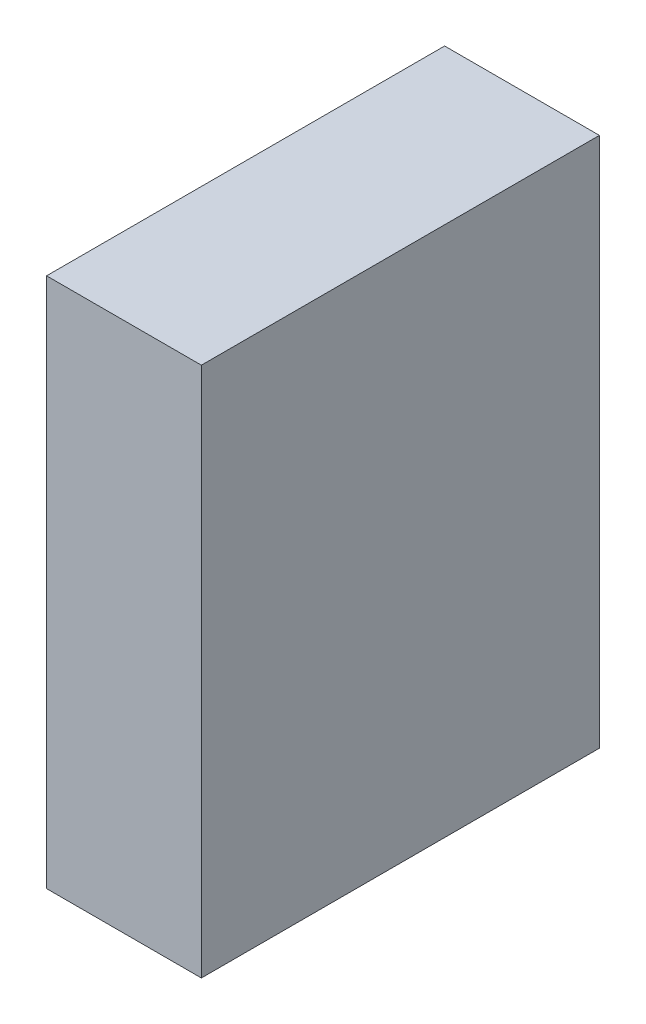
ISO-10303-21;
HEADER;
FILE_DESCRIPTION(('STEP AP214'),'2;1');
FILE_NAME('part.step','',(''),(''),'','','');
FILE_SCHEMA(('AUTOMOTIVE_DESIGN { 1 0 10303 214 1 1 1 1 }'));
ENDSEC;
DATA;
#1=APPLICATION_CONTEXT('core data for automotive mechanical design processes');
#2=APPLICATION_PROTOCOL_DEFINITION('international standard','automotive_design',2000,#1);
#3=PRODUCT_CONTEXT('',#1,'mechanical');
#4=PRODUCT('Part','Part','',(#3));
#5=PRODUCT_RELATED_PRODUCT_CATEGORY('part','',(#4));
#6=PRODUCT_DEFINITION_FORMATION('','',#4);
#7=PRODUCT_DEFINITION_CONTEXT('part definition',#1,'design');
#8=PRODUCT_DEFINITION('design','',#6,#7);
#9=PRODUCT_DEFINITION_SHAPE('','',#8);
#10=(LENGTH_UNIT() NAMED_UNIT(*) SI_UNIT(.MILLI.,.METRE.));
#11=(NAMED_UNIT(*) PLANE_ANGLE_UNIT() SI_UNIT($,.RADIAN.));
#12=(NAMED_UNIT(*) SI_UNIT($,.STERADIAN.) SOLID_ANGLE_UNIT());
#13=UNCERTAINTY_MEASURE_WITH_UNIT(LENGTH_MEASURE(1.E-05),#10,'distance_accuracy_value','');
#14=(GEOMETRIC_REPRESENTATION_CONTEXT(3) GLOBAL_UNCERTAINTY_ASSIGNED_CONTEXT((#13)) GLOBAL_UNIT_ASSIGNED_CONTEXT((#10,
#11,#12)) REPRESENTATION_CONTEXT('',''));
#15=CARTESIAN_POINT('',(0.,0.,0.));
#16=DIRECTION('',(0.,0.,1.));
#17=DIRECTION('',(1.,0.,0.));
#18=AXIS2_PLACEMENT_3D('',#15,#16,#17);
#19=CARTESIAN_POINT('',(-26.3529411764706,57.8529411764707,90.));
#20=DIRECTION('',(1.,0.,0.));
#21=DIRECTION('',(0.,1.,0.));
#22=AXIS2_PLACEMENT_3D('',#19,#20,#21);
#23=PLANE('',#22);
#24=DIRECTION('',(0.,-1.,0.));
#25=VECTOR('',#24,1.);
#26=CARTESIAN_POINT('',(-26.3529411764706,57.8529411764707,0.));
#27=LINE('',#26,#25);
#28=CARTESIAN_POINT('',(-26.3529411764706,57.8529411764707,0.));
#29=VERTEX_POINT('',#28);
#30=CARTESIAN_POINT('',(-26.3529411764706,-62.1470588235293,0.));
#31=VERTEX_POINT('',#30);
#32=EDGE_CURVE('E98',#29,#31,#27,.T.);
#33=ORIENTED_EDGE('',*,*,#32,.T.);
#34=DIRECTION('',(0.,0.,-1.));
#35=VECTOR('',#34,1.);
#36=CARTESIAN_POINT('',(-26.3529411764706,-62.1470588235293,90.));
#37=LINE('',#36,#35);
#38=CARTESIAN_POINT('',(-26.3529411764706,-62.1470588235293,90.));
#39=VERTEX_POINT('',#38);
#40=EDGE_CURVE('E11',#39,#31,#37,.T.);
#41=ORIENTED_EDGE('',*,*,#40,.F.);
#42=DIRECTION('',(0.,-1.,0.));
#43=VECTOR('',#42,1.);
#44=CARTESIAN_POINT('',(-26.3529411764706,57.8529411764707,90.));
#45=LINE('',#44,#43);
#46=CARTESIAN_POINT('',(-26.3529411764706,57.8529411764707,90.));
#47=VERTEX_POINT('',#46);
#48=EDGE_CURVE('E86',#47,#39,#45,.T.);
#49=ORIENTED_EDGE('',*,*,#48,.F.);
#50=DIRECTION('',(0.,0.,-1.));
#51=VECTOR('',#50,1.);
#52=CARTESIAN_POINT('',(-26.3529411764706,57.8529411764707,90.));
#53=LINE('',#52,#51);
#54=EDGE_CURVE('E94',#47,#29,#53,.T.);
#55=ORIENTED_EDGE('',*,*,#54,.T.);
#56=EDGE_LOOP('',(#33,#41,#49,#55));
#57=FACE_BOUND('',#56,.T.);
#58=ADVANCED_FACE('F35',(#57),#23,.F.);
#59=CARTESIAN_POINT('',(-26.3529411764706,-62.1470588235293,90.));
#60=DIRECTION('',(0.,1.,0.));
#61=DIRECTION('',(0.,0.,1.));
#62=AXIS2_PLACEMENT_3D('',#59,#60,#61);
#63=PLANE('',#62);
#64=DIRECTION('',(1.,0.,0.));
#65=VECTOR('',#64,1.);
#66=CARTESIAN_POINT('',(-26.3529411764706,-62.1470588235293,0.));
#67=LINE('',#66,#65);
#68=CARTESIAN_POINT('',(8.64705882352944,-62.1470588235293,0.));
#69=VERTEX_POINT('',#68);
#70=EDGE_CURVE('E90',#31,#69,#67,.T.);
#71=ORIENTED_EDGE('',*,*,#70,.T.);
#72=DIRECTION('',(0.,0.,-1.));
#73=VECTOR('',#72,1.);
#74=CARTESIAN_POINT('',(8.64705882352944,-62.1470588235293,90.));
#75=LINE('',#74,#73);
#76=CARTESIAN_POINT('',(8.64705882352944,-62.1470588235293,90.));
#77=VERTEX_POINT('',#76);
#78=EDGE_CURVE('E43',#77,#69,#75,.T.);
#79=ORIENTED_EDGE('',*,*,#78,.F.);
#80=DIRECTION('',(1.,0.,0.));
#81=VECTOR('',#80,1.);
#82=CARTESIAN_POINT('',(-26.3529411764706,-62.1470588235293,90.));
#83=LINE('',#82,#81);
#84=EDGE_CURVE('E81',#39,#77,#83,.T.);
#85=ORIENTED_EDGE('',*,*,#84,.F.);
#86=ORIENTED_EDGE('',*,*,#40,.T.);
#87=EDGE_LOOP('',(#71,#79,#85,#86));
#88=FACE_BOUND('',#87,.T.);
#89=ADVANCED_FACE('F89',(#88),#63,.F.);
#90=CARTESIAN_POINT('',(8.64705882352942,57.8529411764707,90.));
#91=DIRECTION('',(-1.,0.,0.));
#92=DIRECTION('',(0.,-1.,0.));
#93=AXIS2_PLACEMENT_3D('',#90,#91,#92);
#94=PLANE('',#93);
#95=DIRECTION('',(0.,1.,0.));
#96=VECTOR('',#95,1.);
#97=CARTESIAN_POINT('',(8.64705882352942,57.8529411764707,0.));
#98=LINE('',#97,#96);
#99=CARTESIAN_POINT('',(8.64705882352942,57.8529411764707,0.));
#100=VERTEX_POINT('',#99);
#101=EDGE_CURVE('E68',#69,#100,#98,.T.);
#102=ORIENTED_EDGE('',*,*,#101,.T.);
#103=DIRECTION('',(0.,0.,-1.));
#104=VECTOR('',#103,1.);
#105=CARTESIAN_POINT('',(8.64705882352942,57.8529411764707,90.));
#106=LINE('',#105,#104);
#107=CARTESIAN_POINT('',(8.64705882352942,57.8529411764707,90.));
#108=VERTEX_POINT('',#107);
#109=EDGE_CURVE('E91',#108,#100,#106,.T.);
#110=ORIENTED_EDGE('',*,*,#109,.F.);
#111=DIRECTION('',(0.,1.,0.));
#112=VECTOR('',#111,1.);
#113=CARTESIAN_POINT('',(8.64705882352942,57.8529411764707,90.));
#114=LINE('',#113,#112);
#115=EDGE_CURVE('E84',#77,#108,#114,.T.);
#116=ORIENTED_EDGE('',*,*,#115,.F.);
#117=ORIENTED_EDGE('',*,*,#78,.T.);
#118=EDGE_LOOP('',(#102,#110,#116,#117));
#119=FACE_BOUND('',#118,.T.);
#120=ADVANCED_FACE('F92',(#119),#94,.F.);
#121=CARTESIAN_POINT('',(-26.3529411764706,57.8529411764707,90.));
#122=DIRECTION('',(0.,-1.,0.));
#123=DIRECTION('',(0.,0.,-1.));
#124=AXIS2_PLACEMENT_3D('',#121,#122,#123);
#125=PLANE('',#124);
#126=DIRECTION('',(-1.,0.,0.));
#127=VECTOR('',#126,1.);
#128=CARTESIAN_POINT('',(-26.3529411764706,57.8529411764707,0.));
#129=LINE('',#128,#127);
#130=EDGE_CURVE('E74',#100,#29,#129,.T.);
#131=ORIENTED_EDGE('',*,*,#130,.T.);
#132=ORIENTED_EDGE('',*,*,#54,.F.);
#133=DIRECTION('',(-1.,0.,0.));
#134=VECTOR('',#133,1.);
#135=CARTESIAN_POINT('',(-26.3529411764706,57.8529411764707,90.));
#136=LINE('',#135,#134);
#137=EDGE_CURVE('E51',#108,#47,#136,.T.);
#138=ORIENTED_EDGE('',*,*,#137,.F.);
#139=ORIENTED_EDGE('',*,*,#109,.T.);
#140=EDGE_LOOP('',(#131,#132,#138,#139));
#141=FACE_BOUND('',#140,.T.);
#142=ADVANCED_FACE('F106',(#141),#125,.F.);
#143=CARTESIAN_POINT('',(0.,0.,90.));
#144=DIRECTION('',(0.,0.,1.));
#145=DIRECTION('',(1.,0.,0.));
#146=AXIS2_PLACEMENT_3D('',#143,#144,#145);
#147=PLANE('',#146);
#148=ORIENTED_EDGE('',*,*,#48,.T.);
#149=ORIENTED_EDGE('',*,*,#84,.T.);
#150=ORIENTED_EDGE('',*,*,#115,.T.);
#151=ORIENTED_EDGE('',*,*,#137,.T.);
#152=EDGE_LOOP('',(#148,#149,#150,#151));
#153=FACE_BOUND('',#152,.T.);
#154=ADVANCED_FACE('F82',(#153),#147,.T.);
#155=CARTESIAN_POINT('',(0.,0.,0.));
#156=DIRECTION('',(0.,0.,1.));
#157=DIRECTION('',(1.,0.,0.));
#158=AXIS2_PLACEMENT_3D('',#155,#156,#157);
#159=PLANE('',#158);
#160=CARTESIAN_POINT('',(-8.85294117647055,52.8529411764707,0.));
#161=DIRECTION('',(0.,0.,-1.));
#162=DIRECTION('',(-1.,0.,0.));
#163=AXIS2_PLACEMENT_3D('',#160,#161,#162);
#164=CIRCLE('',#163,2.1);
#165=CARTESIAN_POINT('',(-10.9529411764705,52.8529411764707,0.));
#166=VERTEX_POINT('',#165);
#167=EDGE_CURVE('E118',#166,#166,#164,.T.);
#168=ORIENTED_EDGE('',*,*,#167,.F.);
#169=EDGE_LOOP('',(#168));
#170=FACE_BOUND('',#169,.T.);
#171=CARTESIAN_POINT('',(-8.85294117647056,-55.1470588235293,0.));
#172=DIRECTION('',(0.,0.,-1.));
#173=DIRECTION('',(-1.,0.,0.));
#174=AXIS2_PLACEMENT_3D('',#171,#172,#173);
#175=CIRCLE('',#174,2.1);
#176=CARTESIAN_POINT('',(-10.9529411764706,-55.1470588235293,0.));
#177=VERTEX_POINT('',#176);
#178=EDGE_CURVE('E112',#177,#177,#175,.T.);
#179=ORIENTED_EDGE('',*,*,#178,.F.);
#180=EDGE_LOOP('',(#179));
#181=FACE_BOUND('',#180,.T.);
#182=ORIENTED_EDGE('',*,*,#32,.F.);
#183=ORIENTED_EDGE('',*,*,#130,.F.);
#184=ORIENTED_EDGE('',*,*,#101,.F.);
#185=ORIENTED_EDGE('',*,*,#70,.F.);
#186=EDGE_LOOP('',(#182,#183,#184,#185));
#187=FACE_BOUND('',#186,.T.);
#188=ADVANCED_FACE('F109',(#170,#181,#187),#159,.F.);
#189=CARTESIAN_POINT('',(-8.85294117647056,-55.1470588235293,5.));
#190=DIRECTION('',(0.,0.,-1.));
#191=DIRECTION('',(-1.,0.,0.));
#192=AXIS2_PLACEMENT_3D('',#189,#190,#191);
#193=CYLINDRICAL_SURFACE('',#192,2.1);
#194=CARTESIAN_POINT('',(-8.85294117647056,-55.1470588235293,5.));
#195=DIRECTION('',(0.,0.,-1.));
#196=DIRECTION('',(-1.,0.,0.));
#197=AXIS2_PLACEMENT_3D('',#194,#195,#196);
#198=CIRCLE('',#197,2.1);
#199=CARTESIAN_POINT('',(-10.9529411764706,-55.1470588235293,5.));
#200=VERTEX_POINT('',#199);
#201=EDGE_CURVE('E115',#200,#200,#198,.T.);
#202=ORIENTED_EDGE('',*,*,#201,.F.);
#203=EDGE_LOOP('',(#202));
#204=FACE_BOUND('',#203,.T.);
#205=ORIENTED_EDGE('',*,*,#178,.T.);
#206=EDGE_LOOP('',(#205));
#207=FACE_BOUND('',#206,.T.);
#208=ADVANCED_FACE('F135',(#204,#207),#193,.F.);
#209=CARTESIAN_POINT('',(-8.85294117647056,-55.1470588235293,5.));
#210=DIRECTION('',(0.,0.,-1.));
#211=DIRECTION('',(-1.,0.,0.));
#212=AXIS2_PLACEMENT_3D('',#209,#210,#211);
#213=PLANE('',#212);
#214=ORIENTED_EDGE('',*,*,#201,.T.);
#215=EDGE_LOOP('',(#214));
#216=FACE_BOUND('',#215,.T.);
#217=ADVANCED_FACE('F129',(#216),#213,.T.);
#218=CARTESIAN_POINT('',(-8.85294117647055,52.8529411764707,5.));
#219=DIRECTION('',(0.,0.,-1.));
#220=DIRECTION('',(-1.,0.,0.));
#221=AXIS2_PLACEMENT_3D('',#218,#219,#220);
#222=CYLINDRICAL_SURFACE('',#221,2.1);
#223=CARTESIAN_POINT('',(-8.85294117647055,52.8529411764707,5.));
#224=DIRECTION('',(0.,0.,-1.));
#225=DIRECTION('',(-1.,0.,0.));
#226=AXIS2_PLACEMENT_3D('',#223,#224,#225);
#227=CIRCLE('',#226,2.1);
#228=CARTESIAN_POINT('',(-10.9529411764705,52.8529411764707,5.));
#229=VERTEX_POINT('',#228);
#230=EDGE_CURVE('E101',#229,#229,#227,.T.);
#231=ORIENTED_EDGE('',*,*,#230,.F.);
#232=EDGE_LOOP('',(#231));
#233=FACE_BOUND('',#232,.T.);
#234=ORIENTED_EDGE('',*,*,#167,.T.);
#235=EDGE_LOOP('',(#234));
#236=FACE_BOUND('',#235,.T.);
#237=ADVANCED_FACE('F126',(#233,#236),#222,.F.);
#238=CARTESIAN_POINT('',(-8.85294117647055,52.8529411764707,5.));
#239=DIRECTION('',(0.,0.,-1.));
#240=DIRECTION('',(-1.,0.,0.));
#241=AXIS2_PLACEMENT_3D('',#238,#239,#240);
#242=PLANE('',#241);
#243=ORIENTED_EDGE('',*,*,#230,.T.);
#244=EDGE_LOOP('',(#243));
#245=FACE_BOUND('',#244,.T.);
#246=ADVANCED_FACE('F124',(#245),#242,.T.);
#247=CLOSED_SHELL('',(#58,#89,#120,#142,#154,#188,#208,#217,#237,#246));
#248=MANIFOLD_SOLID_BREP('B2',#247);
#249=ADVANCED_BREP_SHAPE_REPRESENTATION('',(#18,#248),#14);
#250=SHAPE_DEFINITION_REPRESENTATION(#9,#249);
ENDSEC;
END-ISO-10303-21;
